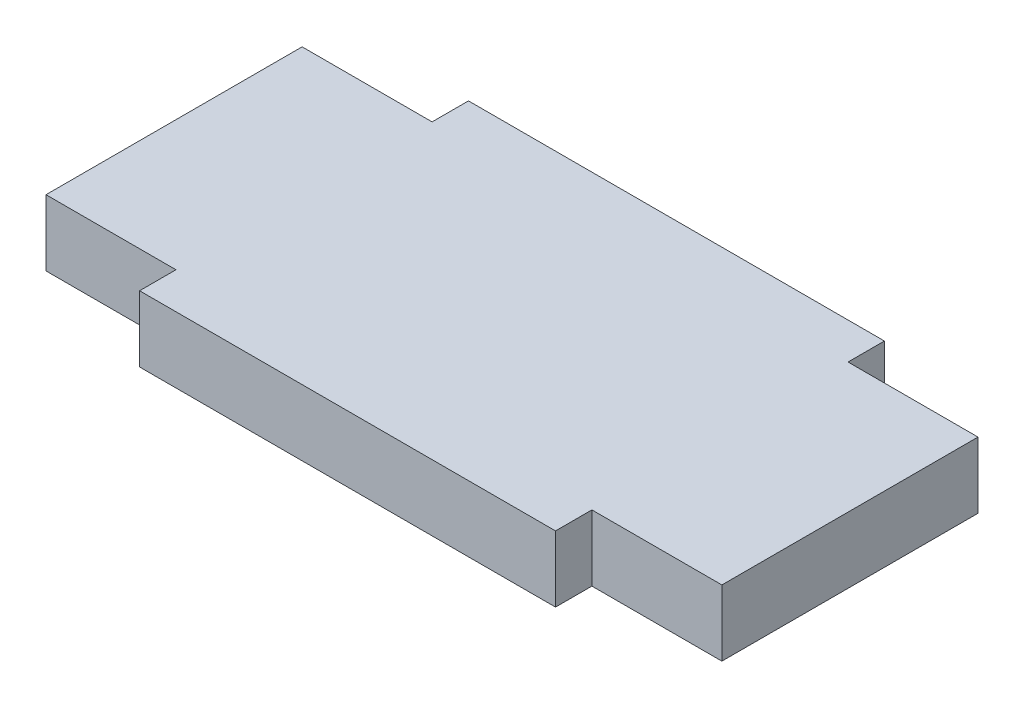
ISO-10303-21;
HEADER;
FILE_DESCRIPTION(('STEP AP214'),'2;1');
FILE_NAME('part.step','',(''),(''),'','','');
FILE_SCHEMA(('AUTOMOTIVE_DESIGN { 1 0 10303 214 1 1 1 1 }'));
ENDSEC;
DATA;
#1=APPLICATION_CONTEXT('core data for automotive mechanical design processes');
#2=APPLICATION_PROTOCOL_DEFINITION('international standard','automotive_design',2000,#1);
#3=PRODUCT_CONTEXT('',#1,'mechanical');
#4=PRODUCT('Part','Part','',(#3));
#5=PRODUCT_RELATED_PRODUCT_CATEGORY('part','',(#4));
#6=PRODUCT_DEFINITION_FORMATION('','',#4);
#7=PRODUCT_DEFINITION_CONTEXT('part definition',#1,'design');
#8=PRODUCT_DEFINITION('design','',#6,#7);
#9=PRODUCT_DEFINITION_SHAPE('','',#8);
#10=(LENGTH_UNIT() NAMED_UNIT(*) SI_UNIT(.MILLI.,.METRE.));
#11=(NAMED_UNIT(*) PLANE_ANGLE_UNIT() SI_UNIT($,.RADIAN.));
#12=(NAMED_UNIT(*) SI_UNIT($,.STERADIAN.) SOLID_ANGLE_UNIT());
#13=UNCERTAINTY_MEASURE_WITH_UNIT(LENGTH_MEASURE(1.E-05),#10,'distance_accuracy_value','');
#14=(GEOMETRIC_REPRESENTATION_CONTEXT(3) GLOBAL_UNCERTAINTY_ASSIGNED_CONTEXT((#13)) GLOBAL_UNIT_ASSIGNED_CONTEXT((#10,
#11,#12)) REPRESENTATION_CONTEXT('',''));
#15=CARTESIAN_POINT('',(0.,0.,0.));
#16=DIRECTION('',(0.,0.,1.));
#17=DIRECTION('',(1.,0.,0.));
#18=AXIS2_PLACEMENT_3D('',#15,#16,#17);
#19=CARTESIAN_POINT('',(0.,6.35,10.985));
#20=DIRECTION('',(0.,0.,-1.));
#21=DIRECTION('',(-1.,0.,0.));
#22=AXIS2_PLACEMENT_3D('',#19,#20,#21);
#23=PLANE('',#22);
#24=DIRECTION('',(1.,0.,0.));
#25=VECTOR('',#24,1.);
#26=CARTESIAN_POINT('',(0.,0.,10.985));
#27=LINE('',#26,#25);
#28=CARTESIAN_POINT('',(-19.5,0.,10.985));
#29=VERTEX_POINT('',#28);
#30=CARTESIAN_POINT('',(20.5,0.,10.985));
#31=VERTEX_POINT('',#30);
#32=EDGE_CURVE('E172',#29,#31,#27,.T.);
#33=ORIENTED_EDGE('',*,*,#32,.T.);
#34=DIRECTION('',(0.,-1.,0.));
#35=VECTOR('',#34,1.);
#36=CARTESIAN_POINT('',(20.5,6.35,10.985));
#37=LINE('',#36,#35);
#38=CARTESIAN_POINT('',(20.5,6.35,10.985));
#39=VERTEX_POINT('',#38);
#40=EDGE_CURVE('E11',#39,#31,#37,.T.);
#41=ORIENTED_EDGE('',*,*,#40,.F.);
#42=DIRECTION('',(1.,0.,0.));
#43=VECTOR('',#42,1.);
#44=CARTESIAN_POINT('',(0.,6.35,10.985));
#45=LINE('',#44,#43);
#46=CARTESIAN_POINT('',(-19.5,6.35,10.985));
#47=VERTEX_POINT('',#46);
#48=EDGE_CURVE('E216',#47,#39,#45,.T.);
#49=ORIENTED_EDGE('',*,*,#48,.F.);
#50=DIRECTION('',(0.,-1.,0.));
#51=VECTOR('',#50,1.);
#52=CARTESIAN_POINT('',(-19.5,6.35,10.985));
#53=LINE('',#52,#51);
#54=EDGE_CURVE('E64',#47,#29,#53,.T.);
#55=ORIENTED_EDGE('',*,*,#54,.T.);
#56=EDGE_LOOP('',(#33,#41,#49,#55));
#57=FACE_BOUND('',#56,.T.);
#58=ADVANCED_FACE('F47',(#57),#23,.F.);
#59=CARTESIAN_POINT('',(20.5,6.35,0.));
#60=DIRECTION('',(-1.,0.,0.));
#61=DIRECTION('',(0.,0.,1.));
#62=AXIS2_PLACEMENT_3D('',#59,#60,#61);
#63=PLANE('',#62);
#64=DIRECTION('',(0.,0.,-1.));
#65=VECTOR('',#64,1.);
#66=CARTESIAN_POINT('',(20.5,0.,0.));
#67=LINE('',#66,#65);
#68=CARTESIAN_POINT('',(20.5,0.,7.48500000000001));
#69=VERTEX_POINT('',#68);
#70=EDGE_CURVE('E175',#31,#69,#67,.T.);
#71=ORIENTED_EDGE('',*,*,#70,.T.);
#72=DIRECTION('',(0.,-1.,0.));
#73=VECTOR('',#72,1.);
#74=CARTESIAN_POINT('',(20.5,6.35,7.48500000000001));
#75=LINE('',#74,#73);
#76=CARTESIAN_POINT('',(20.5,6.35,7.48500000000001));
#77=VERTEX_POINT('',#76);
#78=EDGE_CURVE('E56',#77,#69,#75,.T.);
#79=ORIENTED_EDGE('',*,*,#78,.F.);
#80=DIRECTION('',(0.,0.,-1.));
#81=VECTOR('',#80,1.);
#82=CARTESIAN_POINT('',(20.5,6.35,0.));
#83=LINE('',#82,#81);
#84=EDGE_CURVE('E115',#39,#77,#83,.T.);
#85=ORIENTED_EDGE('',*,*,#84,.F.);
#86=ORIENTED_EDGE('',*,*,#40,.T.);
#87=EDGE_LOOP('',(#71,#79,#85,#86));
#88=FACE_BOUND('',#87,.T.);
#89=ADVANCED_FACE('F247',(#88),#63,.F.);
#90=CARTESIAN_POINT('',(0.,6.35,7.48500000000001));
#91=DIRECTION('',(0.,0.,1.));
#92=DIRECTION('',(1.,0.,0.));
#93=AXIS2_PLACEMENT_3D('',#90,#91,#92);
#94=PLANE('',#93);
#95=DIRECTION('',(-1.,0.,0.));
#96=VECTOR('',#95,1.);
#97=CARTESIAN_POINT('',(0.,0.,7.48500000000001));
#98=LINE('',#97,#96);
#99=CARTESIAN_POINT('',(33.,0.,7.485));
#100=VERTEX_POINT('',#99);
#101=EDGE_CURVE('E179',#100,#69,#98,.T.);
#102=ORIENTED_EDGE('',*,*,#101,.F.);
#103=DIRECTION('',(0.,-1.,0.));
#104=VECTOR('',#103,1.);
#105=CARTESIAN_POINT('',(33.,6.35,7.485));
#106=LINE('',#105,#104);
#107=CARTESIAN_POINT('',(33.,6.35,7.485));
#108=VERTEX_POINT('',#107);
#109=EDGE_CURVE('E238',#108,#100,#106,.T.);
#110=ORIENTED_EDGE('',*,*,#109,.F.);
#111=DIRECTION('',(-1.,0.,0.));
#112=VECTOR('',#111,1.);
#113=CARTESIAN_POINT('',(0.,6.35,7.48500000000001));
#114=LINE('',#113,#112);
#115=EDGE_CURVE('E246',#108,#77,#114,.T.);
#116=ORIENTED_EDGE('',*,*,#115,.T.);
#117=ORIENTED_EDGE('',*,*,#78,.T.);
#118=EDGE_LOOP('',(#102,#110,#116,#117));
#119=FACE_BOUND('',#118,.T.);
#120=ADVANCED_FACE('F244',(#119),#94,.T.);
#121=CARTESIAN_POINT('',(33.,6.35,0.));
#122=DIRECTION('',(1.,0.,0.));
#123=DIRECTION('',(0.,0.,-1.));
#124=AXIS2_PLACEMENT_3D('',#121,#122,#123);
#125=PLANE('',#124);
#126=DIRECTION('',(0.,0.,1.));
#127=VECTOR('',#126,1.);
#128=CARTESIAN_POINT('',(33.,0.,0.));
#129=LINE('',#128,#127);
#130=CARTESIAN_POINT('',(33.,0.,-17.145));
#131=VERTEX_POINT('',#130);
#132=EDGE_CURVE('E183',#131,#100,#129,.T.);
#133=ORIENTED_EDGE('',*,*,#132,.F.);
#134=DIRECTION('',(0.,-1.,0.));
#135=VECTOR('',#134,1.);
#136=CARTESIAN_POINT('',(33.,6.35,-17.145));
#137=LINE('',#136,#135);
#138=CARTESIAN_POINT('',(33.,6.35,-17.145));
#139=VERTEX_POINT('',#138);
#140=EDGE_CURVE('E235',#139,#131,#137,.T.);
#141=ORIENTED_EDGE('',*,*,#140,.F.);
#142=DIRECTION('',(0.,0.,1.));
#143=VECTOR('',#142,1.);
#144=CARTESIAN_POINT('',(33.,6.35,0.));
#145=LINE('',#144,#143);
#146=EDGE_CURVE('E258',#139,#108,#145,.T.);
#147=ORIENTED_EDGE('',*,*,#146,.T.);
#148=ORIENTED_EDGE('',*,*,#109,.T.);
#149=EDGE_LOOP('',(#133,#141,#147,#148));
#150=FACE_BOUND('',#149,.T.);
#151=ADVANCED_FACE('F254',(#150),#125,.T.);
#152=CARTESIAN_POINT('',(0.,6.35,-17.145));
#153=DIRECTION('',(0.,0.,1.));
#154=DIRECTION('',(1.,0.,0.));
#155=AXIS2_PLACEMENT_3D('',#152,#153,#154);
#156=PLANE('',#155);
#157=DIRECTION('',(-1.,0.,0.));
#158=VECTOR('',#157,1.);
#159=CARTESIAN_POINT('',(0.,0.,-17.145));
#160=LINE('',#159,#158);
#161=CARTESIAN_POINT('',(20.5,0.,-17.145));
#162=VERTEX_POINT('',#161);
#163=EDGE_CURVE('E187',#131,#162,#160,.T.);
#164=ORIENTED_EDGE('',*,*,#163,.T.);
#165=DIRECTION('',(0.,-1.,0.));
#166=VECTOR('',#165,1.);
#167=CARTESIAN_POINT('',(20.5,6.35,-17.145));
#168=LINE('',#167,#166);
#169=CARTESIAN_POINT('',(20.5,6.35,-17.145));
#170=VERTEX_POINT('',#169);
#171=EDGE_CURVE('E232',#170,#162,#168,.T.);
#172=ORIENTED_EDGE('',*,*,#171,.F.);
#173=DIRECTION('',(-1.,0.,0.));
#174=VECTOR('',#173,1.);
#175=CARTESIAN_POINT('',(0.,6.35,-17.145));
#176=LINE('',#175,#174);
#177=EDGE_CURVE('E263',#139,#170,#176,.T.);
#178=ORIENTED_EDGE('',*,*,#177,.F.);
#179=ORIENTED_EDGE('',*,*,#140,.T.);
#180=EDGE_LOOP('',(#164,#172,#178,#179));
#181=FACE_BOUND('',#180,.T.);
#182=ADVANCED_FACE('F308',(#181),#156,.F.);
#183=CARTESIAN_POINT('',(20.5,6.35,0.));
#184=DIRECTION('',(1.,0.,0.));
#185=DIRECTION('',(0.,0.,-1.));
#186=AXIS2_PLACEMENT_3D('',#183,#184,#185);
#187=PLANE('',#186);
#188=DIRECTION('',(0.,0.,1.));
#189=VECTOR('',#188,1.);
#190=CARTESIAN_POINT('',(20.5,0.,0.));
#191=LINE('',#190,#189);
#192=CARTESIAN_POINT('',(20.5,0.,-20.645));
#193=VERTEX_POINT('',#192);
#194=EDGE_CURVE('E191',#193,#162,#191,.T.);
#195=ORIENTED_EDGE('',*,*,#194,.F.);
#196=DIRECTION('',(0.,-1.,0.));
#197=VECTOR('',#196,1.);
#198=CARTESIAN_POINT('',(20.5,6.35,-20.645));
#199=LINE('',#198,#197);
#200=CARTESIAN_POINT('',(20.5,6.35,-20.645));
#201=VERTEX_POINT('',#200);
#202=EDGE_CURVE('E229',#201,#193,#199,.T.);
#203=ORIENTED_EDGE('',*,*,#202,.F.);
#204=DIRECTION('',(0.,0.,1.));
#205=VECTOR('',#204,1.);
#206=CARTESIAN_POINT('',(20.5,6.35,0.));
#207=LINE('',#206,#205);
#208=EDGE_CURVE('E270',#201,#170,#207,.T.);
#209=ORIENTED_EDGE('',*,*,#208,.T.);
#210=ORIENTED_EDGE('',*,*,#171,.T.);
#211=EDGE_LOOP('',(#195,#203,#209,#210));
#212=FACE_BOUND('',#211,.T.);
#213=ADVANCED_FACE('F311',(#212),#187,.T.);
#214=CARTESIAN_POINT('',(0.,6.35,-20.645));
#215=DIRECTION('',(0.,0.,-1.));
#216=DIRECTION('',(-1.,0.,0.));
#217=AXIS2_PLACEMENT_3D('',#214,#215,#216);
#218=PLANE('',#217);
#219=DIRECTION('',(1.,0.,0.));
#220=VECTOR('',#219,1.);
#221=CARTESIAN_POINT('',(0.,0.,-20.645));
#222=LINE('',#221,#220);
#223=CARTESIAN_POINT('',(-19.5,0.,-20.645));
#224=VERTEX_POINT('',#223);
#225=EDGE_CURVE('E195',#224,#193,#222,.T.);
#226=ORIENTED_EDGE('',*,*,#225,.F.);
#227=DIRECTION('',(0.,-1.,0.));
#228=VECTOR('',#227,1.);
#229=CARTESIAN_POINT('',(-19.5,6.35,-20.645));
#230=LINE('',#229,#228);
#231=CARTESIAN_POINT('',(-19.5,6.35,-20.645));
#232=VERTEX_POINT('',#231);
#233=EDGE_CURVE('E226',#232,#224,#230,.T.);
#234=ORIENTED_EDGE('',*,*,#233,.F.);
#235=DIRECTION('',(1.,0.,0.));
#236=VECTOR('',#235,1.);
#237=CARTESIAN_POINT('',(0.,6.35,-20.645));
#238=LINE('',#237,#236);
#239=EDGE_CURVE('E274',#232,#201,#238,.T.);
#240=ORIENTED_EDGE('',*,*,#239,.T.);
#241=ORIENTED_EDGE('',*,*,#202,.T.);
#242=EDGE_LOOP('',(#226,#234,#240,#241));
#243=FACE_BOUND('',#242,.T.);
#244=ADVANCED_FACE('F315',(#243),#218,.T.);
#245=CARTESIAN_POINT('',(-19.5,6.35,0.));
#246=DIRECTION('',(1.,0.,0.));
#247=DIRECTION('',(0.,0.,-1.));
#248=AXIS2_PLACEMENT_3D('',#245,#246,#247);
#249=PLANE('',#248);
#250=DIRECTION('',(0.,0.,1.));
#251=VECTOR('',#250,1.);
#252=CARTESIAN_POINT('',(-19.5,0.,0.));
#253=LINE('',#252,#251);
#254=CARTESIAN_POINT('',(-19.5,0.,-17.145));
#255=VERTEX_POINT('',#254);
#256=EDGE_CURVE('E199',#224,#255,#253,.T.);
#257=ORIENTED_EDGE('',*,*,#256,.T.);
#258=DIRECTION('',(0.,-1.,0.));
#259=VECTOR('',#258,1.);
#260=CARTESIAN_POINT('',(-19.5,6.35,-17.145));
#261=LINE('',#260,#259);
#262=CARTESIAN_POINT('',(-19.5,6.35,-17.145));
#263=VERTEX_POINT('',#262);
#264=EDGE_CURVE('E223',#263,#255,#261,.T.);
#265=ORIENTED_EDGE('',*,*,#264,.F.);
#266=DIRECTION('',(0.,0.,1.));
#267=VECTOR('',#266,1.);
#268=CARTESIAN_POINT('',(-19.5,6.35,0.));
#269=LINE('',#268,#267);
#270=EDGE_CURVE('E278',#232,#263,#269,.T.);
#271=ORIENTED_EDGE('',*,*,#270,.F.);
#272=ORIENTED_EDGE('',*,*,#233,.T.);
#273=EDGE_LOOP('',(#257,#265,#271,#272));
#274=FACE_BOUND('',#273,.T.);
#275=ADVANCED_FACE('F319',(#274),#249,.F.);
#276=CARTESIAN_POINT('',(0.,6.35,-17.145));
#277=DIRECTION('',(0.,0.,-1.));
#278=DIRECTION('',(-1.,0.,0.));
#279=AXIS2_PLACEMENT_3D('',#276,#277,#278);
#280=PLANE('',#279);
#281=DIRECTION('',(1.,0.,0.));
#282=VECTOR('',#281,1.);
#283=CARTESIAN_POINT('',(0.,0.,-17.145));
#284=LINE('',#283,#282);
#285=CARTESIAN_POINT('',(-32.,0.,-17.145));
#286=VERTEX_POINT('',#285);
#287=EDGE_CURVE('E203',#286,#255,#284,.T.);
#288=ORIENTED_EDGE('',*,*,#287,.F.);
#289=DIRECTION('',(0.,-1.,0.));
#290=VECTOR('',#289,1.);
#291=CARTESIAN_POINT('',(-32.,6.35,-17.145));
#292=LINE('',#291,#290);
#293=CARTESIAN_POINT('',(-32.,6.35,-17.145));
#294=VERTEX_POINT('',#293);
#295=EDGE_CURVE('E162',#294,#286,#292,.T.);
#296=ORIENTED_EDGE('',*,*,#295,.F.);
#297=DIRECTION('',(1.,0.,0.));
#298=VECTOR('',#297,1.);
#299=CARTESIAN_POINT('',(0.,6.35,-17.145));
#300=LINE('',#299,#298);
#301=EDGE_CURVE('E150',#294,#263,#300,.T.);
#302=ORIENTED_EDGE('',*,*,#301,.T.);
#303=ORIENTED_EDGE('',*,*,#264,.T.);
#304=EDGE_LOOP('',(#288,#296,#302,#303));
#305=FACE_BOUND('',#304,.T.);
#306=ADVANCED_FACE('F283',(#305),#280,.T.);
#307=CARTESIAN_POINT('',(-32.,6.35,0.));
#308=DIRECTION('',(1.,0.,0.));
#309=DIRECTION('',(0.,0.,-1.));
#310=AXIS2_PLACEMENT_3D('',#307,#308,#309);
#311=PLANE('',#310);
#312=DIRECTION('',(0.,0.,1.));
#313=VECTOR('',#312,1.);
#314=CARTESIAN_POINT('',(-32.,0.,0.));
#315=LINE('',#314,#313);
#316=CARTESIAN_POINT('',(-32.,0.,7.485));
#317=VERTEX_POINT('',#316);
#318=EDGE_CURVE('E158',#286,#317,#315,.T.);
#319=ORIENTED_EDGE('',*,*,#318,.T.);
#320=DIRECTION('',(0.,-1.,0.));
#321=VECTOR('',#320,1.);
#322=CARTESIAN_POINT('',(-32.,6.35,7.485));
#323=LINE('',#322,#321);
#324=CARTESIAN_POINT('',(-32.,6.35,7.485));
#325=VERTEX_POINT('',#324);
#326=EDGE_CURVE('E155',#325,#317,#323,.T.);
#327=ORIENTED_EDGE('',*,*,#326,.F.);
#328=DIRECTION('',(0.,0.,1.));
#329=VECTOR('',#328,1.);
#330=CARTESIAN_POINT('',(-32.,6.35,0.));
#331=LINE('',#330,#329);
#332=EDGE_CURVE('E143',#294,#325,#331,.T.);
#333=ORIENTED_EDGE('',*,*,#332,.F.);
#334=ORIENTED_EDGE('',*,*,#295,.T.);
#335=EDGE_LOOP('',(#319,#327,#333,#334));
#336=FACE_BOUND('',#335,.T.);
#337=ADVANCED_FACE('F156',(#336),#311,.F.);
#338=CARTESIAN_POINT('',(0.,6.35,7.485));
#339=DIRECTION('',(0.,0.,-1.));
#340=DIRECTION('',(-1.,0.,0.));
#341=AXIS2_PLACEMENT_3D('',#338,#339,#340);
#342=PLANE('',#341);
#343=DIRECTION('',(1.,0.,0.));
#344=VECTOR('',#343,1.);
#345=CARTESIAN_POINT('',(0.,0.,7.485));
#346=LINE('',#345,#344);
#347=CARTESIAN_POINT('',(-19.5,0.,7.485));
#348=VERTEX_POINT('',#347);
#349=EDGE_CURVE('E209',#317,#348,#346,.T.);
#350=ORIENTED_EDGE('',*,*,#349,.T.);
#351=DIRECTION('',(0.,-1.,0.));
#352=VECTOR('',#351,1.);
#353=CARTESIAN_POINT('',(-19.5,6.35,7.485));
#354=LINE('',#353,#352);
#355=CARTESIAN_POINT('',(-19.5,6.35,7.485));
#356=VERTEX_POINT('',#355);
#357=EDGE_CURVE('E103',#356,#348,#354,.T.);
#358=ORIENTED_EDGE('',*,*,#357,.F.);
#359=DIRECTION('',(1.,0.,0.));
#360=VECTOR('',#359,1.);
#361=CARTESIAN_POINT('',(0.,6.35,7.485));
#362=LINE('',#361,#360);
#363=EDGE_CURVE('E148',#325,#356,#362,.T.);
#364=ORIENTED_EDGE('',*,*,#363,.F.);
#365=ORIENTED_EDGE('',*,*,#326,.T.);
#366=EDGE_LOOP('',(#350,#358,#364,#365));
#367=FACE_BOUND('',#366,.T.);
#368=ADVANCED_FACE('F164',(#367),#342,.F.);
#369=CARTESIAN_POINT('',(-19.5,6.35,0.));
#370=DIRECTION('',(-1.,0.,0.));
#371=DIRECTION('',(0.,0.,1.));
#372=AXIS2_PLACEMENT_3D('',#369,#370,#371);
#373=PLANE('',#372);
#374=DIRECTION('',(0.,0.,-1.));
#375=VECTOR('',#374,1.);
#376=CARTESIAN_POINT('',(-19.5,0.,0.));
#377=LINE('',#376,#375);
#378=EDGE_CURVE('E212',#29,#348,#377,.T.);
#379=ORIENTED_EDGE('',*,*,#378,.F.);
#380=ORIENTED_EDGE('',*,*,#54,.F.);
#381=DIRECTION('',(0.,0.,-1.));
#382=VECTOR('',#381,1.);
#383=CARTESIAN_POINT('',(-19.5,6.35,0.));
#384=LINE('',#383,#382);
#385=EDGE_CURVE('E166',#47,#356,#384,.T.);
#386=ORIENTED_EDGE('',*,*,#385,.T.);
#387=ORIENTED_EDGE('',*,*,#357,.T.);
#388=EDGE_LOOP('',(#379,#380,#386,#387));
#389=FACE_BOUND('',#388,.T.);
#390=ADVANCED_FACE('F286',(#389),#373,.T.);
#391=CARTESIAN_POINT('',(0.,6.35,0.));
#392=DIRECTION('',(0.,1.,0.));
#393=DIRECTION('',(0.,0.,1.));
#394=AXIS2_PLACEMENT_3D('',#391,#392,#393);
#395=PLANE('',#394);
#396=ORIENTED_EDGE('',*,*,#48,.T.);
#397=ORIENTED_EDGE('',*,*,#84,.T.);
#398=ORIENTED_EDGE('',*,*,#115,.F.);
#399=ORIENTED_EDGE('',*,*,#146,.F.);
#400=ORIENTED_EDGE('',*,*,#177,.T.);
#401=ORIENTED_EDGE('',*,*,#208,.F.);
#402=ORIENTED_EDGE('',*,*,#239,.F.);
#403=ORIENTED_EDGE('',*,*,#270,.T.);
#404=ORIENTED_EDGE('',*,*,#301,.F.);
#405=ORIENTED_EDGE('',*,*,#332,.T.);
#406=ORIENTED_EDGE('',*,*,#363,.T.);
#407=ORIENTED_EDGE('',*,*,#385,.F.);
#408=EDGE_LOOP('',(#396,#397,#398,#399,#400,#401,#402,#403,#404,#405,#406,#407));
#409=FACE_BOUND('',#408,.T.);
#410=ADVANCED_FACE('F145',(#409),#395,.T.);
#411=CARTESIAN_POINT('',(0.,0.,0.));
#412=DIRECTION('',(0.,1.,0.));
#413=DIRECTION('',(0.,0.,1.));
#414=AXIS2_PLACEMENT_3D('',#411,#412,#413);
#415=PLANE('',#414);
#416=ORIENTED_EDGE('',*,*,#32,.F.);
#417=ORIENTED_EDGE('',*,*,#378,.T.);
#418=ORIENTED_EDGE('',*,*,#349,.F.);
#419=ORIENTED_EDGE('',*,*,#318,.F.);
#420=ORIENTED_EDGE('',*,*,#287,.T.);
#421=ORIENTED_EDGE('',*,*,#256,.F.);
#422=ORIENTED_EDGE('',*,*,#225,.T.);
#423=ORIENTED_EDGE('',*,*,#194,.T.);
#424=ORIENTED_EDGE('',*,*,#163,.F.);
#425=ORIENTED_EDGE('',*,*,#132,.T.);
#426=ORIENTED_EDGE('',*,*,#101,.T.);
#427=ORIENTED_EDGE('',*,*,#70,.F.);
#428=EDGE_LOOP('',(#416,#417,#418,#419,#420,#421,#422,#423,#424,#425,#426,#427));
#429=FACE_BOUND('',#428,.T.);
#430=ADVANCED_FACE('F250',(#429),#415,.F.);
#431=CLOSED_SHELL('',(#58,#89,#120,#151,#182,#213,#244,#275,#306,#337,#368,#390,#410,#430));
#432=MANIFOLD_SOLID_BREP('B2',#431);
#433=ADVANCED_BREP_SHAPE_REPRESENTATION('',(#18,#432),#14);
#434=SHAPE_DEFINITION_REPRESENTATION(#9,#433);
ENDSEC;
END-ISO-10303-21;
